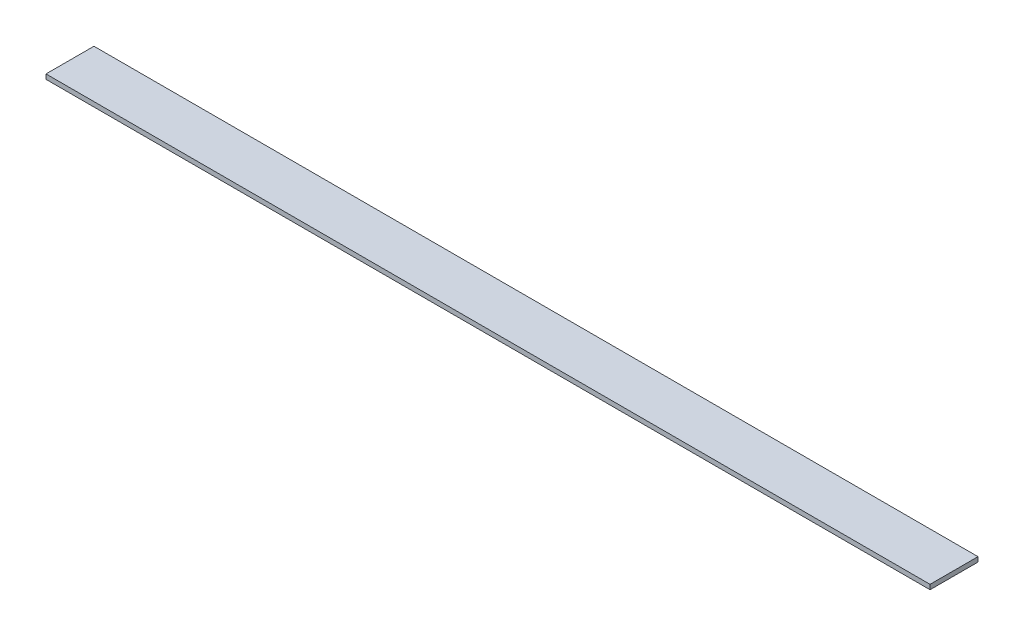
ISO-10303-21;
HEADER;
FILE_DESCRIPTION(('STEP AP214'),'2;1');
FILE_NAME('part.step','',(''),(''),'','','');
FILE_SCHEMA(('AUTOMOTIVE_DESIGN { 1 0 10303 214 1 1 1 1 }'));
ENDSEC;
DATA;
#1=APPLICATION_CONTEXT('core data for automotive mechanical design processes');
#2=APPLICATION_PROTOCOL_DEFINITION('international standard','automotive_design',2000,#1);
#3=PRODUCT_CONTEXT('',#1,'mechanical');
#4=PRODUCT('Part','Part','',(#3));
#5=PRODUCT_RELATED_PRODUCT_CATEGORY('part','',(#4));
#6=PRODUCT_DEFINITION_FORMATION('','',#4);
#7=PRODUCT_DEFINITION_CONTEXT('part definition',#1,'design');
#8=PRODUCT_DEFINITION('design','',#6,#7);
#9=PRODUCT_DEFINITION_SHAPE('','',#8);
#10=(LENGTH_UNIT() NAMED_UNIT(*) SI_UNIT(.MILLI.,.METRE.));
#11=(NAMED_UNIT(*) PLANE_ANGLE_UNIT() SI_UNIT($,.RADIAN.));
#12=(NAMED_UNIT(*) SI_UNIT($,.STERADIAN.) SOLID_ANGLE_UNIT());
#13=UNCERTAINTY_MEASURE_WITH_UNIT(LENGTH_MEASURE(1.E-05),#10,'distance_accuracy_value','');
#14=(GEOMETRIC_REPRESENTATION_CONTEXT(3) GLOBAL_UNCERTAINTY_ASSIGNED_CONTEXT((#13)) GLOBAL_UNIT_ASSIGNED_CONTEXT((#10,
#11,#12)) REPRESENTATION_CONTEXT('',''));
#15=CARTESIAN_POINT('',(0.,0.,0.));
#16=DIRECTION('',(0.,0.,1.));
#17=DIRECTION('',(1.,0.,0.));
#18=AXIS2_PLACEMENT_3D('',#15,#16,#17);
#19=CARTESIAN_POINT('',(936.625,10.,-50.8));
#20=DIRECTION('',(-1.,0.,0.));
#21=DIRECTION('',(0.,0.,1.));
#22=AXIS2_PLACEMENT_3D('',#19,#20,#21);
#23=PLANE('',#22);
#24=DIRECTION('',(0.,0.,-1.));
#25=VECTOR('',#24,1.);
#26=CARTESIAN_POINT('',(936.625,0.,-50.8));
#27=LINE('',#26,#25);
#28=CARTESIAN_POINT('',(936.625,0.,50.8));
#29=VERTEX_POINT('',#28);
#30=CARTESIAN_POINT('',(936.625,0.,-50.8));
#31=VERTEX_POINT('',#30);
#32=EDGE_CURVE('E80',#29,#31,#27,.T.);
#33=ORIENTED_EDGE('',*,*,#32,.T.);
#34=DIRECTION('',(0.,-1.,0.));
#35=VECTOR('',#34,1.);
#36=CARTESIAN_POINT('',(936.625,10.,-50.8));
#37=LINE('',#36,#35);
#38=CARTESIAN_POINT('',(936.625,10.,-50.8));
#39=VERTEX_POINT('',#38);
#40=EDGE_CURVE('E11',#39,#31,#37,.T.);
#41=ORIENTED_EDGE('',*,*,#40,.F.);
#42=DIRECTION('',(0.,0.,-1.));
#43=VECTOR('',#42,1.);
#44=CARTESIAN_POINT('',(936.625,10.,-50.8));
#45=LINE('',#44,#43);
#46=CARTESIAN_POINT('',(936.625,10.,50.8));
#47=VERTEX_POINT('',#46);
#48=EDGE_CURVE('E68',#47,#39,#45,.T.);
#49=ORIENTED_EDGE('',*,*,#48,.F.);
#50=DIRECTION('',(0.,-1.,0.));
#51=VECTOR('',#50,1.);
#52=CARTESIAN_POINT('',(936.625,10.,50.8));
#53=LINE('',#52,#51);
#54=EDGE_CURVE('E76',#47,#29,#53,.T.);
#55=ORIENTED_EDGE('',*,*,#54,.T.);
#56=EDGE_LOOP('',(#33,#41,#49,#55));
#57=FACE_BOUND('',#56,.T.);
#58=ADVANCED_FACE('F17',(#57),#23,.F.);
#59=CARTESIAN_POINT('',(-936.625,10.,-50.8));
#60=DIRECTION('',(0.,0.,1.));
#61=DIRECTION('',(1.,0.,0.));
#62=AXIS2_PLACEMENT_3D('',#59,#60,#61);
#63=PLANE('',#62);
#64=DIRECTION('',(-1.,0.,0.));
#65=VECTOR('',#64,1.);
#66=CARTESIAN_POINT('',(-936.625,0.,-50.8));
#67=LINE('',#66,#65);
#68=CARTESIAN_POINT('',(-936.625,0.,-50.8));
#69=VERTEX_POINT('',#68);
#70=EDGE_CURVE('E72',#31,#69,#67,.T.);
#71=ORIENTED_EDGE('',*,*,#70,.T.);
#72=DIRECTION('',(0.,-1.,0.));
#73=VECTOR('',#72,1.);
#74=CARTESIAN_POINT('',(-936.625,10.,-50.8));
#75=LINE('',#74,#73);
#76=CARTESIAN_POINT('',(-936.625,10.,-50.8));
#77=VERTEX_POINT('',#76);
#78=EDGE_CURVE('E25',#77,#69,#75,.T.);
#79=ORIENTED_EDGE('',*,*,#78,.F.);
#80=DIRECTION('',(-1.,0.,0.));
#81=VECTOR('',#80,1.);
#82=CARTESIAN_POINT('',(-936.625,10.,-50.8));
#83=LINE('',#82,#81);
#84=EDGE_CURVE('E63',#39,#77,#83,.T.);
#85=ORIENTED_EDGE('',*,*,#84,.F.);
#86=ORIENTED_EDGE('',*,*,#40,.T.);
#87=EDGE_LOOP('',(#71,#79,#85,#86));
#88=FACE_BOUND('',#87,.T.);
#89=ADVANCED_FACE('F71',(#88),#63,.F.);
#90=CARTESIAN_POINT('',(-936.625,10.,-50.8));
#91=DIRECTION('',(1.,0.,0.));
#92=DIRECTION('',(0.,0.,-1.));
#93=AXIS2_PLACEMENT_3D('',#90,#91,#92);
#94=PLANE('',#93);
#95=DIRECTION('',(0.,0.,1.));
#96=VECTOR('',#95,1.);
#97=CARTESIAN_POINT('',(-936.625,0.,-50.8));
#98=LINE('',#97,#96);
#99=CARTESIAN_POINT('',(-936.625,0.,50.8));
#100=VERTEX_POINT('',#99);
#101=EDGE_CURVE('E50',#69,#100,#98,.T.);
#102=ORIENTED_EDGE('',*,*,#101,.T.);
#103=DIRECTION('',(0.,-1.,0.));
#104=VECTOR('',#103,1.);
#105=CARTESIAN_POINT('',(-936.625,10.,50.8));
#106=LINE('',#105,#104);
#107=CARTESIAN_POINT('',(-936.625,10.,50.8));
#108=VERTEX_POINT('',#107);
#109=EDGE_CURVE('E73',#108,#100,#106,.T.);
#110=ORIENTED_EDGE('',*,*,#109,.F.);
#111=DIRECTION('',(0.,0.,1.));
#112=VECTOR('',#111,1.);
#113=CARTESIAN_POINT('',(-936.625,10.,-50.8));
#114=LINE('',#113,#112);
#115=EDGE_CURVE('E66',#77,#108,#114,.T.);
#116=ORIENTED_EDGE('',*,*,#115,.F.);
#117=ORIENTED_EDGE('',*,*,#78,.T.);
#118=EDGE_LOOP('',(#102,#110,#116,#117));
#119=FACE_BOUND('',#118,.T.);
#120=ADVANCED_FACE('F74',(#119),#94,.F.);
#121=CARTESIAN_POINT('',(-936.625,10.,50.8));
#122=DIRECTION('',(0.,0.,-1.));
#123=DIRECTION('',(-1.,0.,0.));
#124=AXIS2_PLACEMENT_3D('',#121,#122,#123);
#125=PLANE('',#124);
#126=DIRECTION('',(1.,0.,0.));
#127=VECTOR('',#126,1.);
#128=CARTESIAN_POINT('',(-936.625,0.,50.8));
#129=LINE('',#128,#127);
#130=EDGE_CURVE('E56',#100,#29,#129,.T.);
#131=ORIENTED_EDGE('',*,*,#130,.T.);
#132=ORIENTED_EDGE('',*,*,#54,.F.);
#133=DIRECTION('',(1.,0.,0.));
#134=VECTOR('',#133,1.);
#135=CARTESIAN_POINT('',(-936.625,10.,50.8));
#136=LINE('',#135,#134);
#137=EDGE_CURVE('E33',#108,#47,#136,.T.);
#138=ORIENTED_EDGE('',*,*,#137,.F.);
#139=ORIENTED_EDGE('',*,*,#109,.T.);
#140=EDGE_LOOP('',(#131,#132,#138,#139));
#141=FACE_BOUND('',#140,.T.);
#142=ADVANCED_FACE('F87',(#141),#125,.F.);
#143=CARTESIAN_POINT('',(936.625,10.,50.8));
#144=DIRECTION('',(0.,1.,0.));
#145=DIRECTION('',(0.,0.,1.));
#146=AXIS2_PLACEMENT_3D('',#143,#144,#145);
#147=PLANE('',#146);
#148=ORIENTED_EDGE('',*,*,#48,.T.);
#149=ORIENTED_EDGE('',*,*,#84,.T.);
#150=ORIENTED_EDGE('',*,*,#115,.T.);
#151=ORIENTED_EDGE('',*,*,#137,.T.);
#152=EDGE_LOOP('',(#148,#149,#150,#151));
#153=FACE_BOUND('',#152,.T.);
#154=ADVANCED_FACE('F64',(#153),#147,.T.);
#155=CARTESIAN_POINT('',(936.625,0.,50.8));
#156=DIRECTION('',(0.,1.,0.));
#157=DIRECTION('',(0.,0.,1.));
#158=AXIS2_PLACEMENT_3D('',#155,#156,#157);
#159=PLANE('',#158);
#160=ORIENTED_EDGE('',*,*,#32,.F.);
#161=ORIENTED_EDGE('',*,*,#130,.F.);
#162=ORIENTED_EDGE('',*,*,#101,.F.);
#163=ORIENTED_EDGE('',*,*,#70,.F.);
#164=EDGE_LOOP('',(#160,#161,#162,#163));
#165=FACE_BOUND('',#164,.T.);
#166=ADVANCED_FACE('F90',(#165),#159,.F.);
#167=CLOSED_SHELL('',(#58,#89,#120,#142,#154,#166));
#168=MANIFOLD_SOLID_BREP('B1',#167);
#169=ADVANCED_BREP_SHAPE_REPRESENTATION('',(#18,#168),#14);
#170=SHAPE_DEFINITION_REPRESENTATION(#9,#169);
ENDSEC;
END-ISO-10303-21;
